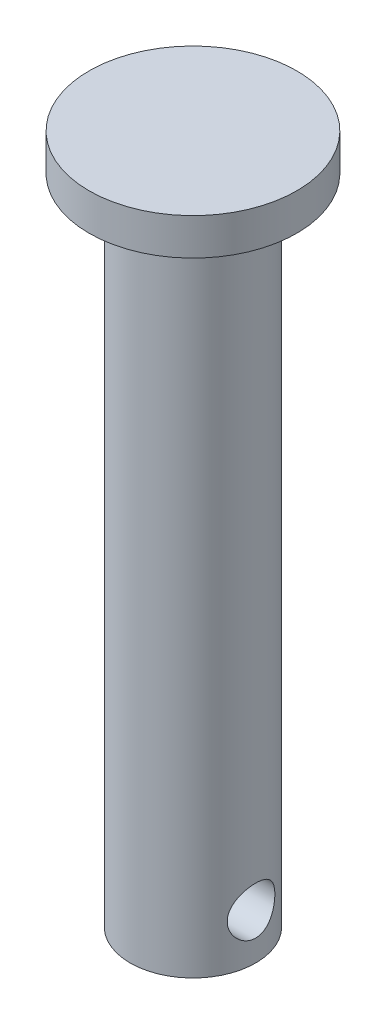
ISO-10303-21;
HEADER;
FILE_DESCRIPTION(('STEP AP214'),'2;1');
FILE_NAME('part.step','',(''),(''),'','','');
FILE_SCHEMA(('AUTOMOTIVE_DESIGN { 1 0 10303 214 1 1 1 1 }'));
ENDSEC;
DATA;
#1=APPLICATION_CONTEXT('core data for automotive mechanical design processes');
#2=APPLICATION_PROTOCOL_DEFINITION('international standard','automotive_design',2000,#1);
#3=PRODUCT_CONTEXT('',#1,'mechanical');
#4=PRODUCT('Part','Part','',(#3));
#5=PRODUCT_RELATED_PRODUCT_CATEGORY('part','',(#4));
#6=PRODUCT_DEFINITION_FORMATION('','',#4);
#7=PRODUCT_DEFINITION_CONTEXT('part definition',#1,'design');
#8=PRODUCT_DEFINITION('design','',#6,#7);
#9=PRODUCT_DEFINITION_SHAPE('','',#8);
#10=(LENGTH_UNIT() NAMED_UNIT(*) SI_UNIT(.MILLI.,.METRE.));
#11=(NAMED_UNIT(*) PLANE_ANGLE_UNIT() SI_UNIT($,.RADIAN.));
#12=(NAMED_UNIT(*) SI_UNIT($,.STERADIAN.) SOLID_ANGLE_UNIT());
#13=UNCERTAINTY_MEASURE_WITH_UNIT(LENGTH_MEASURE(1.E-05),#10,'distance_accuracy_value','');
#14=(GEOMETRIC_REPRESENTATION_CONTEXT(3) GLOBAL_UNCERTAINTY_ASSIGNED_CONTEXT((#13)) GLOBAL_UNIT_ASSIGNED_CONTEXT((#10,
#11,#12)) REPRESENTATION_CONTEXT('',''));
#15=CARTESIAN_POINT('',(0.,0.,0.));
#16=DIRECTION('',(0.,0.,1.));
#17=DIRECTION('',(1.,0.,0.));
#18=AXIS2_PLACEMENT_3D('',#15,#16,#17);
#19=CARTESIAN_POINT('',(0.,-30.15,0.));
#20=DIRECTION('',(0.,1.,0.));
#21=DIRECTION('',(0.,0.,1.));
#22=AXIS2_PLACEMENT_3D('',#19,#20,#21);
#23=CYLINDRICAL_SURFACE('',#22,2.9);
#24=CARTESIAN_POINT('',(-2.68328157299975,-28.05,-1.1));
#25=CARTESIAN_POINT('',(-2.68327922428061,-28.1093489957827,-1.10000248458652));
#26=CARTESIAN_POINT('',(-2.68527194816873,-28.1686818478587,-1.09518093454106));
#27=CARTESIAN_POINT('',(-2.69296977625882,-28.2855554067235,-1.07611268162352));
#28=CARTESIAN_POINT('',(-2.69867470301504,-28.3430961990362,-1.06186642925785));
#29=CARTESIAN_POINT('',(-2.71305970150571,-28.4546639656839,-1.02454933942359));
#30=CARTESIAN_POINT('',(-2.72173249092959,-28.5086991593079,-1.00150008615598));
#31=CARTESIAN_POINT('',(-2.74106414626587,-28.612156903674,-0.947307985473208));
#32=CARTESIAN_POINT('',(-2.75172362287233,-28.661578029053,-0.916162648211992));
#33=CARTESIAN_POINT('',(-2.77443512570219,-28.7569192849796,-0.844965414548746));
#34=CARTESIAN_POINT('',(-2.78652876390518,-28.8025716237422,-0.804568095265991));
#35=CARTESIAN_POINT('',(-2.81039925445747,-28.8866430388596,-0.716746059198641));
#36=CARTESIAN_POINT('',(-2.82217603672252,-28.9250605260548,-0.669319802562992));
#37=CARTESIAN_POINT('',(-2.84458196401774,-28.9948701560771,-0.566745202086737));
#38=CARTESIAN_POINT('',(-2.85515665634353,-29.0259700459012,-0.511384997850494));
#39=CARTESIAN_POINT('',(-2.87346559490726,-29.0783036116571,-0.395746254146733));
#40=CARTESIAN_POINT('',(-2.88120085063207,-29.0995407947278,-0.335469471972143));
#41=CARTESIAN_POINT('',(-2.89266387119534,-29.1306033835331,-0.214524787227563));
#42=CARTESIAN_POINT('',(-2.89655309068144,-29.1408900805804,-0.153990961935245));
#43=CARTESIAN_POINT('',(-2.90046595516458,-29.1512389796451,-0.031939630583864));
#44=CARTESIAN_POINT('',(-2.9004908861957,-29.1513045832395,0.029577541401328));
#45=CARTESIAN_POINT('',(-2.89677431077073,-29.1414754067378,0.14853825001169));
#46=CARTESIAN_POINT('',(-2.89322331838582,-29.1320844439505,0.2060304086711));
#47=CARTESIAN_POINT('',(-2.88300492931398,-29.1044578020864,0.318552502837979));
#48=CARTESIAN_POINT('',(-2.87633731139644,-29.0862214951281,0.373582263250618));
#49=CARTESIAN_POINT('',(-2.86042254178452,-29.0411940177408,0.480576439062401));
#50=CARTESIAN_POINT('',(-2.85113900511872,-29.0142813456148,0.532484085861092));
#51=CARTESIAN_POINT('',(-2.83092877962131,-28.9527736373333,0.63117638536569));
#52=CARTESIAN_POINT('',(-2.82000155459727,-28.9181760925109,0.677959357697908));
#53=CARTESIAN_POINT('',(-2.79685697398916,-28.839866195459,0.768037767468278));
#54=CARTESIAN_POINT('',(-2.7846015436762,-28.795732846916,0.810957985207524));
#55=CARTESIAN_POINT('',(-2.76070055852013,-28.7008255667262,0.88893159880426));
#56=CARTESIAN_POINT('',(-2.74905516483828,-28.6500498925572,0.92398292379018));
#57=CARTESIAN_POINT('',(-2.72744956768312,-28.5417858459963,0.985963844451359));
#58=CARTESIAN_POINT('',(-2.71753465419085,-28.4841692143271,1.01268647609242));
#59=CARTESIAN_POINT('',(-2.70103732259648,-28.3647782244557,1.05590670284941));
#60=CARTESIAN_POINT('',(-2.69445299882884,-28.3030062667863,1.07241014629886));
#61=CARTESIAN_POINT('',(-2.68581406995569,-28.18077260692,1.09386005815007));
#62=CARTESIAN_POINT('',(-2.68352566239426,-28.1204324136924,1.0994039762716));
#63=CARTESIAN_POINT('',(-2.68307507283055,-27.9996537282618,1.10050432818759));
#64=CARTESIAN_POINT('',(-2.68491182496839,-27.9392152654818,1.09606334188405));
#65=CARTESIAN_POINT('',(-2.69226671824544,-27.8230618758687,1.07786206129302));
#66=CARTESIAN_POINT('',(-2.69760001004972,-27.7672606244478,1.06456920532543));
#67=CARTESIAN_POINT('',(-2.7111261186948,-27.6587079715532,1.02963271118627));
#68=CARTESIAN_POINT('',(-2.71931952954047,-27.6059572062758,1.00798733822056));
#69=CARTESIAN_POINT('',(-2.73802573291347,-27.5027702792883,0.956034940410264));
#70=CARTESIAN_POINT('',(-2.74861489819177,-27.4524984964488,0.925429749414474));
#71=CARTESIAN_POINT('',(-2.77079316727057,-27.3575924384407,0.856741568259134));
#72=CARTESIAN_POINT('',(-2.78238264338846,-27.3129602777112,0.818655787024471));
#73=CARTESIAN_POINT('',(-2.80616770118132,-27.2275840747558,0.733153611019962));
#74=CARTESIAN_POINT('',(-2.81835359950513,-27.1872825638096,0.685291082628647));
#75=CARTESIAN_POINT('',(-2.84123732375253,-27.1152276813709,0.583184609426029));
#76=CARTESIAN_POINT('',(-2.85193513643075,-27.0834743859632,0.528940607821527));
#77=CARTESIAN_POINT('',(-2.87063616892688,-27.0296128482981,0.415610983343923));
#78=CARTESIAN_POINT('',(-2.87864733308523,-27.0074761117823,0.356540288773049));
#79=CARTESIAN_POINT('',(-2.89109401464001,-26.9735818843982,0.235139344795649));
#80=CARTESIAN_POINT('',(-2.89553125612603,-26.9618193886506,0.172810682531761));
#81=CARTESIAN_POINT('',(-2.90016328731524,-26.9495564895614,0.050658318150835));
#82=CARTESIAN_POINT('',(-2.90059470016221,-26.9484278829323,-0.00909389404199003));
#83=CARTESIAN_POINT('',(-2.89778717379496,-26.9558416335808,-0.127901157559073));
#84=CARTESIAN_POINT('',(-2.89454869471531,-26.9643827784555,-0.18695629534524));
#85=CARTESIAN_POINT('',(-2.8848750389771,-26.9904508157464,-0.301165868643171));
#86=CARTESIAN_POINT('',(-2.87852321046742,-27.0077437840756,-0.356381298759012));
#87=CARTESIAN_POINT('',(-2.86328858759242,-27.0505895625212,-0.463129089883909));
#88=CARTESIAN_POINT('',(-2.85440531389639,-27.0761439370635,-0.514660751055327));
#89=CARTESIAN_POINT('',(-2.83452467507603,-27.1360198175127,-0.614976465542052));
#90=CARTESIAN_POINT('',(-2.82345355361749,-27.1706675401821,-0.663550913575489));
#91=CARTESIAN_POINT('',(-2.80055278756133,-27.2472363494234,-0.754388675138865));
#92=CARTESIAN_POINT('',(-2.78872287075173,-27.2891600555027,-0.796649705473975));
#93=CARTESIAN_POINT('',(-2.76484922874998,-27.3817954218275,-0.876025383679001));
#94=CARTESIAN_POINT('',(-2.75282876859055,-27.4328606343524,-0.912736027336448));
#95=CARTESIAN_POINT('',(-2.73065635649221,-27.5408138736477,-0.977076367086537));
#96=CARTESIAN_POINT('',(-2.7205046828706,-27.5977027657753,-1.00470471103813));
#97=CARTESIAN_POINT('',(-2.70291934803477,-27.7190113021179,-1.05113434765141));
#98=CARTESIAN_POINT('',(-2.69566125827775,-27.7836714241292,-1.06938090340288));
#99=CARTESIAN_POINT('',(-2.68584535520345,-27.915562494293,-1.09380807528596));
#100=CARTESIAN_POINT('',(-2.68328423275257,-27.9827915984167,-1.0999971863873));
#101=CARTESIAN_POINT('',(-2.68328157299975,-28.05,-1.1));
#102=B_SPLINE_CURVE_WITH_KNOTS('',3,(#24,#25,#26,#27,#28,#29,#30,#31,#32,#33,#34,#35,#36,#37,
#38,#39,#40,#41,#42,#43,#44,#45,#46,#47,#48,#49,#50,#51,#52,#53,#54,#55,#56,#57,#58,#59,#60,#61,
#62,#63,#64,#65,#66,#67,#68,#69,#70,#71,#72,#73,#74,#75,#76,#77,#78,#79,#80,#81,#82,#83,#84,#85,
#86,#87,#88,#89,#90,#91,#92,#93,#94,#95,#96,#97,#98,#99,#100,#101),.UNSPECIFIED.,.T.,.F.,(4,2,2,
2,2,2,2,2,2,2,2,2,2,2,2,2,2,2,2,2,2,2,2,2,2,2,2,2,2,2,2,2,2,2,2,2,2,2,4),(0.,0.177796574464576,
0.355584650760326,0.532939575871951,0.710349108862263,0.895967258544038,1.08162613244064,
1.27376977172793,1.46584503309233,1.64946317987082,1.83302021845158,2.00728945781907,
2.18157106939744,2.35840779424604,2.53530233113083,2.72276283516801,2.91027261586172,
3.10212634980536,3.29387018616065,3.47483657897536,3.65575621902349,3.82780839632731,
3.99989632763184,4.1785304511878,4.35723135177682,4.54757053004695,4.73791140240686,
4.92768437491853,5.1173657444689,5.29576586204596,5.47414361411973,5.64798724425535,
5.821863813687,6.00312410764832,6.18444979501808,6.37562052515605,6.5668197032486,
6.76830333868922,6.96964496914397),.UNSPECIFIED.);
#103=CARTESIAN_POINT('',(-2.68328157299975,-28.05,-1.1));
#104=VERTEX_POINT('',#103);
#105=EDGE_CURVE('E40',#104,#104,#102,.T.);
#106=ORIENTED_EDGE('',*,*,#105,.F.);
#107=EDGE_LOOP('',(#106));
#108=FACE_BOUND('',#107,.T.);
#109=CARTESIAN_POINT('',(2.68328157299975,-28.05,-1.1));
#110=CARTESIAN_POINT('',(2.68327922428061,-27.9906510042173,-1.10000248458652));
#111=CARTESIAN_POINT('',(2.68527194816873,-27.9313181521413,-1.09518093454106));
#112=CARTESIAN_POINT('',(2.69296977625882,-27.8144445932765,-1.07611268162352));
#113=CARTESIAN_POINT('',(2.69867470301504,-27.7569038009638,-1.06186642925785));
#114=CARTESIAN_POINT('',(2.71305970150571,-27.6453360343161,-1.02454933942359));
#115=CARTESIAN_POINT('',(2.72173249092959,-27.5913008406921,-1.00150008615598));
#116=CARTESIAN_POINT('',(2.74106414626587,-27.487843096326,-0.947307985473208));
#117=CARTESIAN_POINT('',(2.75172362287233,-27.438421970947,-0.916162648211992));
#118=CARTESIAN_POINT('',(2.77443512570219,-27.3430807150204,-0.844965414548747));
#119=CARTESIAN_POINT('',(2.78652876390518,-27.2974283762578,-0.804568095265993));
#120=CARTESIAN_POINT('',(2.81039925445747,-27.2133569611404,-0.716746059198644));
#121=CARTESIAN_POINT('',(2.82217603672252,-27.1749394739452,-0.669319802562993));
#122=CARTESIAN_POINT('',(2.84458196401774,-27.1051298439229,-0.566745202086737));
#123=CARTESIAN_POINT('',(2.85515665634353,-27.0740299540988,-0.511384997850494));
#124=CARTESIAN_POINT('',(2.87346559490726,-27.0216963883429,-0.395746254146733));
#125=CARTESIAN_POINT('',(2.88120085063207,-27.0004592052722,-0.335469471972143));
#126=CARTESIAN_POINT('',(2.89266387119534,-26.9693966164669,-0.214524787227563));
#127=CARTESIAN_POINT('',(2.89655309068144,-26.9591099194196,-0.153990961935245));
#128=CARTESIAN_POINT('',(2.90046595516458,-26.9487610203549,-0.0319396305838634));
#129=CARTESIAN_POINT('',(2.9004908861957,-26.9486954167605,0.0295775414013283));
#130=CARTESIAN_POINT('',(2.89677431077073,-26.9585245932622,0.14853825001169));
#131=CARTESIAN_POINT('',(2.89322331838582,-26.9679155560495,0.2060304086711));
#132=CARTESIAN_POINT('',(2.88300492931398,-26.9955421979136,0.318552502837979));
#133=CARTESIAN_POINT('',(2.87633731139644,-27.0137785048719,0.373582263250618));
#134=CARTESIAN_POINT('',(2.86042254178452,-27.0588059822592,0.480576439062401));
#135=CARTESIAN_POINT('',(2.85113900511872,-27.0857186543852,0.532484085861092));
#136=CARTESIAN_POINT('',(2.83092877962131,-27.1472263626667,0.63117638536569));
#137=CARTESIAN_POINT('',(2.82000155459727,-27.1818239074891,0.677959357697908));
#138=CARTESIAN_POINT('',(2.79685697398916,-27.260133804541,0.768037767468278));
#139=CARTESIAN_POINT('',(2.7846015436762,-27.304267153084,0.810957985207524));
#140=CARTESIAN_POINT('',(2.76070055852013,-27.3991744332738,0.88893159880426));
#141=CARTESIAN_POINT('',(2.74905516483828,-27.4499501074428,0.92398292379018));
#142=CARTESIAN_POINT('',(2.72744956768312,-27.5582141540037,0.985963844451359));
#143=CARTESIAN_POINT('',(2.71753465419085,-27.6158307856729,1.01268647609242));
#144=CARTESIAN_POINT('',(2.70103732259648,-27.7352217755443,1.05590670284941));
#145=CARTESIAN_POINT('',(2.69445299882884,-27.7969937332137,1.07241014629886));
#146=CARTESIAN_POINT('',(2.68581406995569,-27.91922739308,1.09386005815007));
#147=CARTESIAN_POINT('',(2.68352566239426,-27.9795675863076,1.0994039762716));
#148=CARTESIAN_POINT('',(2.68307507283055,-28.1003462717382,1.10050432818759));
#149=CARTESIAN_POINT('',(2.68491182496839,-28.1607847345182,1.09606334188405));
#150=CARTESIAN_POINT('',(2.69226671824544,-28.2769381241313,1.07786206129302));
#151=CARTESIAN_POINT('',(2.69760001004972,-28.3327393755522,1.06456920532543));
#152=CARTESIAN_POINT('',(2.71112611869479,-28.4412920284468,1.02963271118627));
#153=CARTESIAN_POINT('',(2.71931952954047,-28.4940427937242,1.00798733822056));
#154=CARTESIAN_POINT('',(2.73802573291347,-28.5972297207117,0.956034940410264));
#155=CARTESIAN_POINT('',(2.74861489819177,-28.6475015035512,0.925429749414474));
#156=CARTESIAN_POINT('',(2.77079316727057,-28.7424075615593,0.856741568259134));
#157=CARTESIAN_POINT('',(2.78238264338846,-28.7870397222888,0.818655787024471));
#158=CARTESIAN_POINT('',(2.80616770118132,-28.8724159252442,0.733153611019962));
#159=CARTESIAN_POINT('',(2.81835359950513,-28.9127174361904,0.685291082628648));
#160=CARTESIAN_POINT('',(2.84123732375253,-28.9847723186291,0.58318460942603));
#161=CARTESIAN_POINT('',(2.85193513643075,-29.0165256140368,0.528940607821528));
#162=CARTESIAN_POINT('',(2.87063616892688,-29.0703871517019,0.415610983343922));
#163=CARTESIAN_POINT('',(2.87864733308523,-29.0925238882177,0.356540288773049));
#164=CARTESIAN_POINT('',(2.89109401464001,-29.1264181156018,0.235139344795648));
#165=CARTESIAN_POINT('',(2.89553125612603,-29.1381806113494,0.172810682531761));
#166=CARTESIAN_POINT('',(2.90016328731524,-29.1504435104386,0.0506583181508351));
#167=CARTESIAN_POINT('',(2.90059470016221,-29.1515721170677,-0.00909389404198984));
#168=CARTESIAN_POINT('',(2.89778717379496,-29.1441583664192,-0.127901157559073));
#169=CARTESIAN_POINT('',(2.89454869471531,-29.1356172215445,-0.18695629534524));
#170=CARTESIAN_POINT('',(2.8848750389771,-29.1095491842536,-0.30116586864317));
#171=CARTESIAN_POINT('',(2.87852321046742,-29.0922562159244,-0.35638129875901));
#172=CARTESIAN_POINT('',(2.86328858759242,-29.0494104374788,-0.463129089883907));
#173=CARTESIAN_POINT('',(2.85440531389639,-29.0238560629365,-0.514660751055326));
#174=CARTESIAN_POINT('',(2.83452467507603,-28.9639801824873,-0.614976465542052));
#175=CARTESIAN_POINT('',(2.82345355361749,-28.9293324598179,-0.663550913575489));
#176=CARTESIAN_POINT('',(2.80055278756133,-28.8527636505766,-0.754388675138865));
#177=CARTESIAN_POINT('',(2.78872287075173,-28.8108399444973,-0.796649705473975));
#178=CARTESIAN_POINT('',(2.76484922874998,-28.7182045781725,-0.876025383679001));
#179=CARTESIAN_POINT('',(2.75282876859055,-28.6671393656476,-0.912736027336448));
#180=CARTESIAN_POINT('',(2.73065635649221,-28.5591861263523,-0.977076367086537));
#181=CARTESIAN_POINT('',(2.7205046828706,-28.5022972342247,-1.00470471103813));
#182=CARTESIAN_POINT('',(2.70291934803477,-28.380988697882,-1.05113434765141));
#183=CARTESIAN_POINT('',(2.69566125827775,-28.3163285758708,-1.06938090340288));
#184=CARTESIAN_POINT('',(2.68584535520345,-28.184437505707,-1.09380807528596));
#185=CARTESIAN_POINT('',(2.68328423275257,-28.1172084015833,-1.0999971863873));
#186=CARTESIAN_POINT('',(2.68328157299975,-28.05,-1.1));
#187=B_SPLINE_CURVE_WITH_KNOTS('',3,(#109,#110,#111,#112,#113,#114,#115,#116,#117,#118,#119,
#120,#121,#122,#123,#124,#125,#126,#127,#128,#129,#130,#131,#132,#133,#134,#135,#136,#137,#138,
#139,#140,#141,#142,#143,#144,#145,#146,#147,#148,#149,#150,#151,#152,#153,#154,#155,#156,#157,
#158,#159,#160,#161,#162,#163,#164,#165,#166,#167,#168,#169,#170,#171,#172,#173,#174,#175,#176,
#177,#178,#179,#180,#181,#182,#183,#184,#185,#186),.UNSPECIFIED.,.T.,.F.,(4,2,2,2,2,2,2,2,2,2,2,
2,2,2,2,2,2,2,2,2,2,2,2,2,2,2,2,2,2,2,2,2,2,2,2,2,2,2,4),(0.,0.177796574464576,
0.355584650760326,0.532939575871951,0.710349108862263,0.895967258544033,1.08162613244064,
1.27376977172793,1.46584503309233,1.64946317987082,1.83302021845158,2.00728945781907,
2.18157106939744,2.35840779424604,2.53530233113083,2.72276283516801,2.91027261586172,
3.10212634980536,3.29387018616065,3.47483657897536,3.65575621902349,3.82780839632731,
3.99989632763184,4.1785304511878,4.35723135177682,4.54757053004695,4.73791140240686,
4.92768437491853,5.1173657444689,5.29576586204596,5.47414361411973,5.64798724425534,
5.821863813687,6.00312410764832,6.18444979501808,6.37562052515605,6.5668197032486,
6.76830333868922,6.96964496914397),.UNSPECIFIED.);
#188=CARTESIAN_POINT('',(2.68328157299975,-28.05,-1.1));
#189=VERTEX_POINT('',#188);
#190=EDGE_CURVE('E60',#189,#189,#187,.T.);
#191=ORIENTED_EDGE('',*,*,#190,.F.);
#192=EDGE_LOOP('',(#191));
#193=FACE_BOUND('',#192,.T.);
#194=CARTESIAN_POINT('',(0.,-30.15,0.));
#195=DIRECTION('',(0.,1.,0.));
#196=DIRECTION('',(0.,0.,1.));
#197=AXIS2_PLACEMENT_3D('',#194,#195,#196);
#198=CIRCLE('',#197,2.9);
#199=CARTESIAN_POINT('',(0.,-30.15,2.9));
#200=VERTEX_POINT('',#199);
#201=EDGE_CURVE('E10',#200,#200,#198,.T.);
#202=ORIENTED_EDGE('',*,*,#201,.T.);
#203=EDGE_LOOP('',(#202));
#204=FACE_BOUND('',#203,.T.);
#205=CARTESIAN_POINT('',(0.,0.,0.));
#206=DIRECTION('',(0.,1.,0.));
#207=DIRECTION('',(0.,0.,1.));
#208=AXIS2_PLACEMENT_3D('',#205,#206,#207);
#209=CIRCLE('',#208,2.9);
#210=CARTESIAN_POINT('',(0.,0.,2.9));
#211=VERTEX_POINT('',#210);
#212=EDGE_CURVE('E49',#211,#211,#209,.T.);
#213=ORIENTED_EDGE('',*,*,#212,.F.);
#214=EDGE_LOOP('',(#213));
#215=FACE_BOUND('',#214,.T.);
#216=ADVANCED_FACE('F36',(#108,#193,#204,#215),#23,.T.);
#217=CARTESIAN_POINT('',(0.,-30.15,0.));
#218=DIRECTION('',(0.,1.,0.));
#219=DIRECTION('',(0.,0.,1.));
#220=AXIS2_PLACEMENT_3D('',#217,#218,#219);
#221=PLANE('',#220);
#222=ORIENTED_EDGE('',*,*,#201,.F.);
#223=EDGE_LOOP('',(#222));
#224=FACE_BOUND('',#223,.T.);
#225=ADVANCED_FACE('F82',(#224),#221,.F.);
#226=CARTESIAN_POINT('',(0.,1.7,0.));
#227=DIRECTION('',(0.,-1.,0.));
#228=DIRECTION('',(0.,0.,-1.));
#229=AXIS2_PLACEMENT_3D('',#226,#227,#228);
#230=CYLINDRICAL_SURFACE('',#229,4.8);
#231=CARTESIAN_POINT('',(0.,1.7,0.));
#232=DIRECTION('',(0.,1.,0.));
#233=DIRECTION('',(0.,0.,1.));
#234=AXIS2_PLACEMENT_3D('',#231,#232,#233);
#235=CIRCLE('',#234,4.8);
#236=CARTESIAN_POINT('',(0.,1.7,4.8));
#237=VERTEX_POINT('',#236);
#238=EDGE_CURVE('E55',#237,#237,#235,.T.);
#239=ORIENTED_EDGE('',*,*,#238,.F.);
#240=EDGE_LOOP('',(#239));
#241=FACE_BOUND('',#240,.T.);
#242=CARTESIAN_POINT('',(0.,0.,0.));
#243=DIRECTION('',(0.,1.,0.));
#244=DIRECTION('',(0.,0.,1.));
#245=AXIS2_PLACEMENT_3D('',#242,#243,#244);
#246=CIRCLE('',#245,4.8);
#247=CARTESIAN_POINT('',(0.,0.,4.8));
#248=VERTEX_POINT('',#247);
#249=EDGE_CURVE('E58',#248,#248,#246,.T.);
#250=ORIENTED_EDGE('',*,*,#249,.T.);
#251=EDGE_LOOP('',(#250));
#252=FACE_BOUND('',#251,.T.);
#253=ADVANCED_FACE('F76',(#241,#252),#230,.T.);
#254=CARTESIAN_POINT('',(0.,1.7,0.));
#255=DIRECTION('',(0.,1.,0.));
#256=DIRECTION('',(0.,0.,1.));
#257=AXIS2_PLACEMENT_3D('',#254,#255,#256);
#258=PLANE('',#257);
#259=ORIENTED_EDGE('',*,*,#238,.T.);
#260=EDGE_LOOP('',(#259));
#261=FACE_BOUND('',#260,.T.);
#262=ADVANCED_FACE('F72',(#261),#258,.T.);
#263=CARTESIAN_POINT('',(0.,0.,0.));
#264=DIRECTION('',(0.,1.,0.));
#265=DIRECTION('',(0.,0.,1.));
#266=AXIS2_PLACEMENT_3D('',#263,#264,#265);
#267=PLANE('',#266);
#268=ORIENTED_EDGE('',*,*,#212,.T.);
#269=EDGE_LOOP('',(#268));
#270=FACE_BOUND('',#269,.T.);
#271=ORIENTED_EDGE('',*,*,#249,.F.);
#272=EDGE_LOOP('',(#271));
#273=FACE_BOUND('',#272,.T.);
#274=ADVANCED_FACE('F70',(#270,#273),#267,.F.);
#275=CARTESIAN_POINT('',(-4.8,-28.05,0.));
#276=DIRECTION('',(1.,0.,0.));
#277=DIRECTION('',(0.,0.,-1.));
#278=AXIS2_PLACEMENT_3D('',#275,#276,#277);
#279=CYLINDRICAL_SURFACE('',#278,1.1);
#280=ORIENTED_EDGE('',*,*,#105,.T.);
#281=EDGE_LOOP('',(#280));
#282=FACE_BOUND('',#281,.T.);
#283=ORIENTED_EDGE('',*,*,#190,.T.);
#284=EDGE_LOOP('',(#283));
#285=FACE_BOUND('',#284,.T.);
#286=ADVANCED_FACE('F66',(#282,#285),#279,.F.);
#287=CLOSED_SHELL('',(#216,#225,#253,#262,#274,#286));
#288=MANIFOLD_SOLID_BREP('B2',#287);
#289=ADVANCED_BREP_SHAPE_REPRESENTATION('',(#18,#288),#14);
#290=SHAPE_DEFINITION_REPRESENTATION(#9,#289);
ENDSEC;
END-ISO-10303-21;
